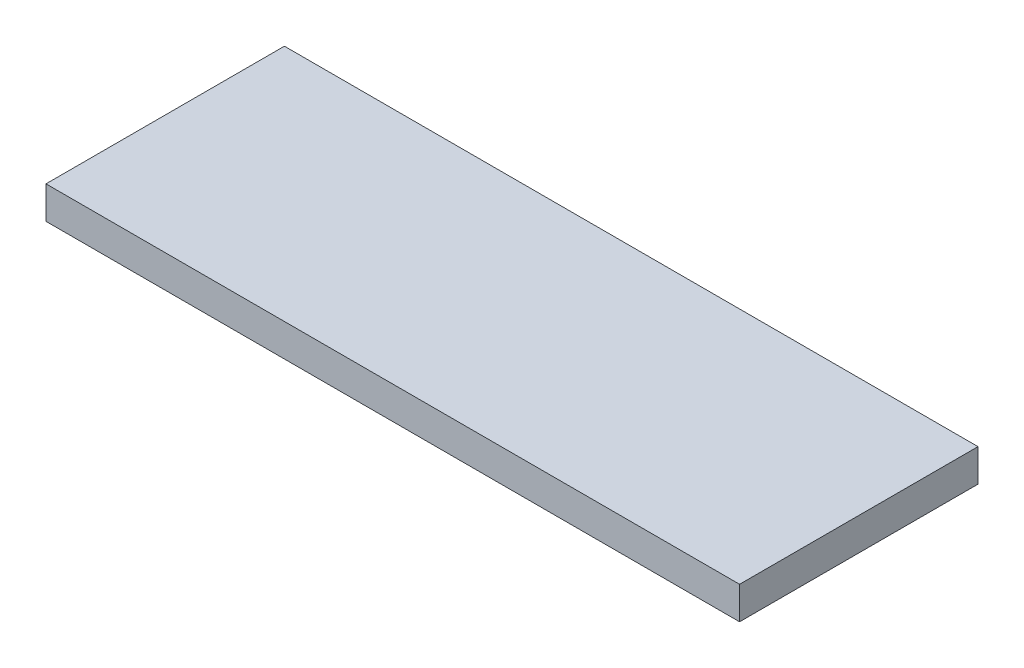
ISO-10303-21;
HEADER;
FILE_DESCRIPTION(('STEP AP214'),'2;1');
FILE_NAME('part.step','',(''),(''),'','','');
FILE_SCHEMA(('AUTOMOTIVE_DESIGN { 1 0 10303 214 1 1 1 1 }'));
ENDSEC;
DATA;
#1=APPLICATION_CONTEXT('core data for automotive mechanical design processes');
#2=APPLICATION_PROTOCOL_DEFINITION('international standard','automotive_design',2000,#1);
#3=PRODUCT_CONTEXT('',#1,'mechanical');
#4=PRODUCT('Part','Part','',(#3));
#5=PRODUCT_RELATED_PRODUCT_CATEGORY('part','',(#4));
#6=PRODUCT_DEFINITION_FORMATION('','',#4);
#7=PRODUCT_DEFINITION_CONTEXT('part definition',#1,'design');
#8=PRODUCT_DEFINITION('design','',#6,#7);
#9=PRODUCT_DEFINITION_SHAPE('','',#8);
#10=(LENGTH_UNIT() NAMED_UNIT(*) SI_UNIT(.MILLI.,.METRE.));
#11=(NAMED_UNIT(*) PLANE_ANGLE_UNIT() SI_UNIT($,.RADIAN.));
#12=(NAMED_UNIT(*) SI_UNIT($,.STERADIAN.) SOLID_ANGLE_UNIT());
#13=UNCERTAINTY_MEASURE_WITH_UNIT(LENGTH_MEASURE(1.E-05),#10,'distance_accuracy_value','');
#14=(GEOMETRIC_REPRESENTATION_CONTEXT(3) GLOBAL_UNCERTAINTY_ASSIGNED_CONTEXT((#13)) GLOBAL_UNIT_ASSIGNED_CONTEXT((#10,
#11,#12)) REPRESENTATION_CONTEXT('',''));
#15=CARTESIAN_POINT('',(0.,0.,0.));
#16=DIRECTION('',(0.,0.,1.));
#17=DIRECTION('',(1.,0.,0.));
#18=AXIS2_PLACEMENT_3D('',#15,#16,#17);
#19=CARTESIAN_POINT('',(80.,3.75,-27.5));
#20=DIRECTION('',(-1.,0.,0.));
#21=DIRECTION('',(0.,0.,1.));
#22=AXIS2_PLACEMENT_3D('',#19,#20,#21);
#23=PLANE('',#22);
#24=DIRECTION('',(0.,0.,-1.));
#25=VECTOR('',#24,1.);
#26=CARTESIAN_POINT('',(80.,-3.75,-27.5));
#27=LINE('',#26,#25);
#28=CARTESIAN_POINT('',(80.,-3.75,27.5));
#29=VERTEX_POINT('',#28);
#30=CARTESIAN_POINT('',(80.,-3.75,-27.5));
#31=VERTEX_POINT('',#30);
#32=EDGE_CURVE('E349',#29,#31,#27,.T.);
#33=ORIENTED_EDGE('',*,*,#32,.T.);
#34=DIRECTION('',(0.,-1.,0.));
#35=VECTOR('',#34,1.);
#36=CARTESIAN_POINT('',(80.,3.75,-27.5));
#37=LINE('',#36,#35);
#38=CARTESIAN_POINT('',(80.,3.75,-27.5));
#39=VERTEX_POINT('',#38);
#40=EDGE_CURVE('E11',#39,#31,#37,.T.);
#41=ORIENTED_EDGE('',*,*,#40,.F.);
#42=DIRECTION('',(0.,0.,-1.));
#43=VECTOR('',#42,1.);
#44=CARTESIAN_POINT('',(80.,3.75,-27.5));
#45=LINE('',#44,#43);
#46=CARTESIAN_POINT('',(80.,3.75,27.5));
#47=VERTEX_POINT('',#46);
#48=EDGE_CURVE('E359',#47,#39,#45,.T.);
#49=ORIENTED_EDGE('',*,*,#48,.F.);
#50=DIRECTION('',(0.,-1.,0.));
#51=VECTOR('',#50,1.);
#52=CARTESIAN_POINT('',(80.,3.75,27.5));
#53=LINE('',#52,#51);
#54=EDGE_CURVE('E373',#47,#29,#53,.T.);
#55=ORIENTED_EDGE('',*,*,#54,.T.);
#56=EDGE_LOOP('',(#33,#41,#49,#55));
#57=FACE_BOUND('',#56,.T.);
#58=ADVANCED_FACE('F41',(#57),#23,.F.);
#59=CARTESIAN_POINT('',(-80.,3.75,-27.5));
#60=DIRECTION('',(0.,0.,1.));
#61=DIRECTION('',(1.,0.,0.));
#62=AXIS2_PLACEMENT_3D('',#59,#60,#61);
#63=PLANE('',#62);
#64=DIRECTION('',(-1.,0.,0.));
#65=VECTOR('',#64,1.);
#66=CARTESIAN_POINT('',(-80.,-3.75,-27.5));
#67=LINE('',#66,#65);
#68=CARTESIAN_POINT('',(-80.,-3.75,-27.5));
#69=VERTEX_POINT('',#68);
#70=EDGE_CURVE('E377',#31,#69,#67,.T.);
#71=ORIENTED_EDGE('',*,*,#70,.T.);
#72=DIRECTION('',(0.,-1.,0.));
#73=VECTOR('',#72,1.);
#74=CARTESIAN_POINT('',(-80.,3.75,-27.5));
#75=LINE('',#74,#73);
#76=CARTESIAN_POINT('',(-80.,3.75,-27.5));
#77=VERTEX_POINT('',#76);
#78=EDGE_CURVE('E49',#77,#69,#75,.T.);
#79=ORIENTED_EDGE('',*,*,#78,.F.);
#80=DIRECTION('',(-1.,0.,0.));
#81=VECTOR('',#80,1.);
#82=CARTESIAN_POINT('',(-80.,3.75,-27.5));
#83=LINE('',#82,#81);
#84=EDGE_CURVE('E363',#39,#77,#83,.T.);
#85=ORIENTED_EDGE('',*,*,#84,.F.);
#86=ORIENTED_EDGE('',*,*,#40,.T.);
#87=EDGE_LOOP('',(#71,#79,#85,#86));
#88=FACE_BOUND('',#87,.T.);
#89=ADVANCED_FACE('F413',(#88),#63,.F.);
#90=CARTESIAN_POINT('',(-80.,3.75,-27.5));
#91=DIRECTION('',(1.,0.,0.));
#92=DIRECTION('',(0.,0.,-1.));
#93=AXIS2_PLACEMENT_3D('',#90,#91,#92);
#94=PLANE('',#93);
#95=DIRECTION('',(0.,0.,1.));
#96=VECTOR('',#95,1.);
#97=CARTESIAN_POINT('',(-80.,-3.75,-27.5));
#98=LINE('',#97,#96);
#99=CARTESIAN_POINT('',(-80.,-3.75,27.5));
#100=VERTEX_POINT('',#99);
#101=EDGE_CURVE('E380',#69,#100,#98,.T.);
#102=ORIENTED_EDGE('',*,*,#101,.T.);
#103=DIRECTION('',(0.,-1.,0.));
#104=VECTOR('',#103,1.);
#105=CARTESIAN_POINT('',(-80.,3.75,27.5));
#106=LINE('',#105,#104);
#107=CARTESIAN_POINT('',(-80.,3.75,27.5));
#108=VERTEX_POINT('',#107);
#109=EDGE_CURVE('E388',#108,#100,#106,.T.);
#110=ORIENTED_EDGE('',*,*,#109,.F.);
#111=DIRECTION('',(0.,0.,1.));
#112=VECTOR('',#111,1.);
#113=CARTESIAN_POINT('',(-80.,3.75,-27.5));
#114=LINE('',#113,#112);
#115=EDGE_CURVE('E367',#77,#108,#114,.T.);
#116=ORIENTED_EDGE('',*,*,#115,.F.);
#117=ORIENTED_EDGE('',*,*,#78,.T.);
#118=EDGE_LOOP('',(#102,#110,#116,#117));
#119=FACE_BOUND('',#118,.T.);
#120=ADVANCED_FACE('F397',(#119),#94,.F.);
#121=CARTESIAN_POINT('',(-80.,3.75,27.5));
#122=DIRECTION('',(0.,0.,-1.));
#123=DIRECTION('',(-1.,0.,0.));
#124=AXIS2_PLACEMENT_3D('',#121,#122,#123);
#125=PLANE('',#124);
#126=DIRECTION('',(1.,0.,0.));
#127=VECTOR('',#126,1.);
#128=CARTESIAN_POINT('',(-80.,-3.75,27.5));
#129=LINE('',#128,#127);
#130=EDGE_CURVE('E364',#100,#29,#129,.T.);
#131=ORIENTED_EDGE('',*,*,#130,.T.);
#132=ORIENTED_EDGE('',*,*,#54,.F.);
#133=DIRECTION('',(1.,0.,0.));
#134=VECTOR('',#133,1.);
#135=CARTESIAN_POINT('',(-80.,3.75,27.5));
#136=LINE('',#135,#134);
#137=EDGE_CURVE('E370',#108,#47,#136,.T.);
#138=ORIENTED_EDGE('',*,*,#137,.F.);
#139=ORIENTED_EDGE('',*,*,#109,.T.);
#140=EDGE_LOOP('',(#131,#132,#138,#139));
#141=FACE_BOUND('',#140,.T.);
#142=ADVANCED_FACE('F406',(#141),#125,.F.);
#143=CARTESIAN_POINT('',(0.,3.75,0.));
#144=DIRECTION('',(0.,1.,0.));
#145=DIRECTION('',(0.,0.,1.));
#146=AXIS2_PLACEMENT_3D('',#143,#144,#145);
#147=PLANE('',#146);
#148=ORIENTED_EDGE('',*,*,#48,.T.);
#149=ORIENTED_EDGE('',*,*,#84,.T.);
#150=ORIENTED_EDGE('',*,*,#115,.T.);
#151=ORIENTED_EDGE('',*,*,#137,.T.);
#152=EDGE_LOOP('',(#148,#149,#150,#151));
#153=FACE_BOUND('',#152,.T.);
#154=ADVANCED_FACE('F412',(#153),#147,.T.);
#155=CARTESIAN_POINT('',(0.,-3.75,0.));
#156=DIRECTION('',(0.,1.,0.));
#157=DIRECTION('',(0.,0.,1.));
#158=AXIS2_PLACEMENT_3D('',#155,#156,#157);
#159=PLANE('',#158);
#160=DIRECTION('',(1.,0.,0.));
#161=VECTOR('',#160,1.);
#162=CARTESIAN_POINT('',(-31.1681547239452,-3.75,9.49999999999309));
#163=LINE('',#162,#161);
#164=CARTESIAN_POINT('',(-41.1681547239446,-3.75,9.49999999999308));
#165=VERTEX_POINT('',#164);
#166=CARTESIAN_POINT('',(-31.1681547239452,-3.75,9.49999999999309));
#167=VERTEX_POINT('',#166);
#168=EDGE_CURVE('E266',#165,#167,#163,.T.);
#169=ORIENTED_EDGE('',*,*,#168,.F.);
#170=DIRECTION('',(0.,0.,1.));
#171=VECTOR('',#170,1.);
#172=CARTESIAN_POINT('',(-41.1681547239446,-3.75,9.49999999999308));
#173=LINE('',#172,#171);
#174=CARTESIAN_POINT('',(-41.1681547239446,-3.75,-9.5000000000069));
#175=VERTEX_POINT('',#174);
#176=EDGE_CURVE('E56',#175,#165,#173,.T.);
#177=ORIENTED_EDGE('',*,*,#176,.F.);
#178=DIRECTION('',(-1.,0.,0.));
#179=VECTOR('',#178,1.);
#180=CARTESIAN_POINT('',(-41.1681547239446,-3.75,-9.5000000000069));
#181=LINE('',#180,#179);
#182=CARTESIAN_POINT('',(-31.1681547239452,-3.75,-9.5000000000069));
#183=VERTEX_POINT('',#182);
#184=EDGE_CURVE('E235',#183,#175,#181,.T.);
#185=ORIENTED_EDGE('',*,*,#184,.F.);
#186=DIRECTION('',(0.,0.,1.));
#187=VECTOR('',#186,1.);
#188=CARTESIAN_POINT('',(-31.1681547239452,-3.75,-9.5000000000069));
#189=LINE('',#188,#187);
#190=CARTESIAN_POINT('',(-31.1681547239452,-3.75,-25.5000000000069));
#191=VERTEX_POINT('',#190);
#192=EDGE_CURVE('E286',#191,#183,#189,.T.);
#193=ORIENTED_EDGE('',*,*,#192,.F.);
#194=DIRECTION('',(1.,0.,0.));
#195=VECTOR('',#194,1.);
#196=CARTESIAN_POINT('',(-31.1681547239452,-3.75,-25.5000000000069));
#197=LINE('',#196,#195);
#198=CARTESIAN_POINT('',(-77.1681547239451,-3.75,-25.5000000000069));
#199=VERTEX_POINT('',#198);
#200=EDGE_CURVE('E282',#199,#191,#197,.T.);
#201=ORIENTED_EDGE('',*,*,#200,.F.);
#202=DIRECTION('',(0.,0.,-1.));
#203=VECTOR('',#202,1.);
#204=CARTESIAN_POINT('',(-77.1681547239451,-3.75,-25.5000000000069));
#205=LINE('',#204,#203);
#206=CARTESIAN_POINT('',(-77.1681547239451,-3.75,25.5000000000001));
#207=VERTEX_POINT('',#206);
#208=EDGE_CURVE('E278',#207,#199,#205,.T.);
#209=ORIENTED_EDGE('',*,*,#208,.F.);
#210=DIRECTION('',(-1.,0.,0.));
#211=VECTOR('',#210,1.);
#212=CARTESIAN_POINT('',(-77.1681547239451,-3.75,25.5000000000001));
#213=LINE('',#212,#211);
#214=CARTESIAN_POINT('',(-31.1681547239452,-3.75,25.5000000000001));
#215=VERTEX_POINT('',#214);
#216=EDGE_CURVE('E274',#215,#207,#213,.T.);
#217=ORIENTED_EDGE('',*,*,#216,.F.);
#218=DIRECTION('',(0.,0.,1.));
#219=VECTOR('',#218,1.);
#220=CARTESIAN_POINT('',(-31.1681547239452,-3.75,25.5000000000001));
#221=LINE('',#220,#219);
#222=EDGE_CURVE('E270',#167,#215,#221,.T.);
#223=ORIENTED_EDGE('',*,*,#222,.F.);
#224=EDGE_LOOP('',(#169,#177,#185,#193,#201,#209,#217,#223));
#225=FACE_BOUND('',#224,.T.);
#226=DIRECTION('',(0.,0.,1.));
#227=VECTOR('',#226,1.);
#228=CARTESIAN_POINT('',(76.1681547239451,-3.75,-24.4999999999931));
#229=LINE('',#228,#227);
#230=CARTESIAN_POINT('',(76.1681547239451,-3.75,-24.4999999999931));
#231=VERTEX_POINT('',#230);
#232=CARTESIAN_POINT('',(76.1681547239451,-3.75,-10.4999999999931));
#233=VERTEX_POINT('',#232);
#234=EDGE_CURVE('E214',#231,#233,#229,.T.);
#235=ORIENTED_EDGE('',*,*,#234,.F.);
#236=DIRECTION('',(1.,0.,0.));
#237=VECTOR('',#236,1.);
#238=CARTESIAN_POINT('',(76.1681547239451,-3.75,-24.4999999999931));
#239=LINE('',#238,#237);
#240=CARTESIAN_POINT('',(62.1681547239451,-3.75,-24.4999999999931));
#241=VERTEX_POINT('',#240);
#242=EDGE_CURVE('E64',#241,#231,#239,.T.);
#243=ORIENTED_EDGE('',*,*,#242,.F.);
#244=DIRECTION('',(0.,0.,-1.));
#245=VECTOR('',#244,1.);
#246=CARTESIAN_POINT('',(62.1681547239451,-3.75,-24.4999999999931));
#247=LINE('',#246,#245);
#248=CARTESIAN_POINT('',(62.1681547239451,-3.75,-10.4999999999931));
#249=VERTEX_POINT('',#248);
#250=EDGE_CURVE('E201',#249,#241,#247,.T.);
#251=ORIENTED_EDGE('',*,*,#250,.F.);
#252=DIRECTION('',(-1.,0.,0.));
#253=VECTOR('',#252,1.);
#254=CARTESIAN_POINT('',(76.1681547239451,-3.75,-10.4999999999931));
#255=LINE('',#254,#253);
#256=EDGE_CURVE('E205',#233,#249,#255,.T.);
#257=ORIENTED_EDGE('',*,*,#256,.F.);
#258=EDGE_LOOP('',(#235,#243,#251,#257));
#259=FACE_BOUND('',#258,.T.);
#260=DIRECTION('',(-1.,0.,0.));
#261=VECTOR('',#260,1.);
#262=CARTESIAN_POINT('',(76.1681547239451,-3.75,24.4999999999931));
#263=LINE('',#262,#261);
#264=CARTESIAN_POINT('',(76.1681547239451,-3.75,24.4999999999931));
#265=VERTEX_POINT('',#264);
#266=CARTESIAN_POINT('',(62.1681547239451,-3.75,24.4999999999931));
#267=VERTEX_POINT('',#266);
#268=EDGE_CURVE('E335',#265,#267,#263,.T.);
#269=ORIENTED_EDGE('',*,*,#268,.F.);
#270=DIRECTION('',(0.,0.,1.));
#271=VECTOR('',#270,1.);
#272=CARTESIAN_POINT('',(76.1681547239451,-3.75,24.4999999999931));
#273=LINE('',#272,#271);
#274=CARTESIAN_POINT('',(76.1681547239451,-3.75,10.4999999999931));
#275=VERTEX_POINT('',#274);
#276=EDGE_CURVE('E224',#275,#265,#273,.T.);
#277=ORIENTED_EDGE('',*,*,#276,.F.);
#278=DIRECTION('',(1.,0.,0.));
#279=VECTOR('',#278,1.);
#280=CARTESIAN_POINT('',(76.1681547239451,-3.75,10.4999999999931));
#281=LINE('',#280,#279);
#282=CARTESIAN_POINT('',(62.1681547239451,-3.75,10.4999999999931));
#283=VERTEX_POINT('',#282);
#284=EDGE_CURVE('E320',#283,#275,#281,.T.);
#285=ORIENTED_EDGE('',*,*,#284,.F.);
#286=DIRECTION('',(0.,0.,-1.));
#287=VECTOR('',#286,1.);
#288=CARTESIAN_POINT('',(62.1681547239451,-3.75,24.4999999999931));
#289=LINE('',#288,#287);
#290=EDGE_CURVE('E339',#267,#283,#289,.T.);
#291=ORIENTED_EDGE('',*,*,#290,.F.);
#292=EDGE_LOOP('',(#269,#277,#285,#291));
#293=FACE_BOUND('',#292,.T.);
#294=ORIENTED_EDGE('',*,*,#32,.F.);
#295=ORIENTED_EDGE('',*,*,#130,.F.);
#296=ORIENTED_EDGE('',*,*,#101,.F.);
#297=ORIENTED_EDGE('',*,*,#70,.F.);
#298=EDGE_LOOP('',(#294,#295,#296,#297));
#299=FACE_BOUND('',#298,.T.);
#300=ADVANCED_FACE('F403',(#225,#259,#293,#299),#159,.F.);
#301=CARTESIAN_POINT('',(76.1681547239451,-0.25,24.4999999999931));
#302=DIRECTION('',(1.,0.,0.));
#303=DIRECTION('',(0.,0.,-1.));
#304=AXIS2_PLACEMENT_3D('',#301,#302,#303);
#305=PLANE('',#304);
#306=ORIENTED_EDGE('',*,*,#276,.T.);
#307=DIRECTION('',(0.,-1.,0.));
#308=VECTOR('',#307,1.);
#309=CARTESIAN_POINT('',(76.1681547239451,-0.25,24.4999999999931));
#310=LINE('',#309,#308);
#311=CARTESIAN_POINT('',(76.1681547239451,-0.25,24.4999999999931));
#312=VERTEX_POINT('',#311);
#313=EDGE_CURVE('E332',#312,#265,#310,.T.);
#314=ORIENTED_EDGE('',*,*,#313,.F.);
#315=DIRECTION('',(0.,0.,1.));
#316=VECTOR('',#315,1.);
#317=CARTESIAN_POINT('',(76.1681547239451,-0.25,24.4999999999931));
#318=LINE('',#317,#316);
#319=CARTESIAN_POINT('',(76.1681547239451,-0.25,10.4999999999931));
#320=VERTEX_POINT('',#319);
#321=EDGE_CURVE('E315',#320,#312,#318,.T.);
#322=ORIENTED_EDGE('',*,*,#321,.F.);
#323=DIRECTION('',(0.,-1.,0.));
#324=VECTOR('',#323,1.);
#325=CARTESIAN_POINT('',(76.1681547239451,-0.25,10.4999999999931));
#326=LINE('',#325,#324);
#327=EDGE_CURVE('E346',#320,#275,#326,.T.);
#328=ORIENTED_EDGE('',*,*,#327,.T.);
#329=EDGE_LOOP('',(#306,#314,#322,#328));
#330=FACE_BOUND('',#329,.T.);
#331=ADVANCED_FACE('F425',(#330),#305,.F.);
#332=CARTESIAN_POINT('',(76.1681547239451,-0.25,10.4999999999931));
#333=DIRECTION('',(0.,0.,-1.));
#334=DIRECTION('',(-1.,0.,0.));
#335=AXIS2_PLACEMENT_3D('',#332,#333,#334);
#336=PLANE('',#335);
#337=ORIENTED_EDGE('',*,*,#284,.T.);
#338=ORIENTED_EDGE('',*,*,#327,.F.);
#339=DIRECTION('',(1.,0.,0.));
#340=VECTOR('',#339,1.);
#341=CARTESIAN_POINT('',(76.1681547239451,-0.25,10.4999999999931));
#342=LINE('',#341,#340);
#343=CARTESIAN_POINT('',(62.1681547239451,-0.25,10.4999999999931));
#344=VERTEX_POINT('',#343);
#345=EDGE_CURVE('E328',#344,#320,#342,.T.);
#346=ORIENTED_EDGE('',*,*,#345,.F.);
#347=DIRECTION('',(0.,-1.,0.));
#348=VECTOR('',#347,1.);
#349=CARTESIAN_POINT('',(62.1681547239451,-0.25,10.4999999999931));
#350=LINE('',#349,#348);
#351=EDGE_CURVE('E350',#344,#283,#350,.T.);
#352=ORIENTED_EDGE('',*,*,#351,.T.);
#353=EDGE_LOOP('',(#337,#338,#346,#352));
#354=FACE_BOUND('',#353,.T.);
#355=ADVANCED_FACE('F431',(#354),#336,.F.);
#356=CARTESIAN_POINT('',(62.1681547239451,-0.25,24.4999999999931));
#357=DIRECTION('',(-1.,0.,0.));
#358=DIRECTION('',(0.,0.,1.));
#359=AXIS2_PLACEMENT_3D('',#356,#357,#358);
#360=PLANE('',#359);
#361=ORIENTED_EDGE('',*,*,#290,.T.);
#362=ORIENTED_EDGE('',*,*,#351,.F.);
#363=DIRECTION('',(0.,0.,-1.));
#364=VECTOR('',#363,1.);
#365=CARTESIAN_POINT('',(62.1681547239451,-0.25,24.4999999999931));
#366=LINE('',#365,#364);
#367=CARTESIAN_POINT('',(62.1681547239451,-0.25,24.4999999999931));
#368=VERTEX_POINT('',#367);
#369=EDGE_CURVE('E324',#368,#344,#366,.T.);
#370=ORIENTED_EDGE('',*,*,#369,.F.);
#371=DIRECTION('',(0.,-1.,0.));
#372=VECTOR('',#371,1.);
#373=CARTESIAN_POINT('',(62.1681547239451,-0.25,24.4999999999931));
#374=LINE('',#373,#372);
#375=EDGE_CURVE('E353',#368,#267,#374,.T.);
#376=ORIENTED_EDGE('',*,*,#375,.T.);
#377=EDGE_LOOP('',(#361,#362,#370,#376));
#378=FACE_BOUND('',#377,.T.);
#379=ADVANCED_FACE('F437',(#378),#360,.F.);
#380=CARTESIAN_POINT('',(76.1681547239451,-0.25,24.4999999999931));
#381=DIRECTION('',(0.,0.,1.));
#382=DIRECTION('',(1.,0.,0.));
#383=AXIS2_PLACEMENT_3D('',#380,#381,#382);
#384=PLANE('',#383);
#385=ORIENTED_EDGE('',*,*,#268,.T.);
#386=ORIENTED_EDGE('',*,*,#375,.F.);
#387=DIRECTION('',(-1.,0.,0.));
#388=VECTOR('',#387,1.);
#389=CARTESIAN_POINT('',(76.1681547239451,-0.25,24.4999999999931));
#390=LINE('',#389,#388);
#391=EDGE_CURVE('E319',#312,#368,#390,.T.);
#392=ORIENTED_EDGE('',*,*,#391,.F.);
#393=ORIENTED_EDGE('',*,*,#313,.T.);
#394=EDGE_LOOP('',(#385,#386,#392,#393));
#395=FACE_BOUND('',#394,.T.);
#396=ADVANCED_FACE('F433',(#395),#384,.F.);
#397=CARTESIAN_POINT('',(0.,-0.25,0.));
#398=DIRECTION('',(0.,1.,0.));
#399=DIRECTION('',(0.,0.,1.));
#400=AXIS2_PLACEMENT_3D('',#397,#398,#399);
#401=PLANE('',#400);
#402=ORIENTED_EDGE('',*,*,#321,.T.);
#403=ORIENTED_EDGE('',*,*,#391,.T.);
#404=ORIENTED_EDGE('',*,*,#369,.T.);
#405=ORIENTED_EDGE('',*,*,#345,.T.);
#406=EDGE_LOOP('',(#402,#403,#404,#405));
#407=FACE_BOUND('',#406,.T.);
#408=ADVANCED_FACE('F436',(#407),#401,.F.);
#409=CARTESIAN_POINT('',(76.1681547239451,-0.25,-24.4999999999931));
#410=DIRECTION('',(0.,0.,-1.));
#411=DIRECTION('',(-1.,0.,0.));
#412=AXIS2_PLACEMENT_3D('',#409,#410,#411);
#413=PLANE('',#412);
#414=ORIENTED_EDGE('',*,*,#242,.T.);
#415=DIRECTION('',(0.,-1.,0.));
#416=VECTOR('',#415,1.);
#417=CARTESIAN_POINT('',(76.1681547239451,-0.25,-24.4999999999931));
#418=LINE('',#417,#416);
#419=CARTESIAN_POINT('',(76.1681547239451,-0.25,-24.4999999999931));
#420=VERTEX_POINT('',#419);
#421=EDGE_CURVE('E176',#420,#231,#418,.T.);
#422=ORIENTED_EDGE('',*,*,#421,.F.);
#423=DIRECTION('',(1.,0.,0.));
#424=VECTOR('',#423,1.);
#425=CARTESIAN_POINT('',(76.1681547239451,-0.25,-24.4999999999931));
#426=LINE('',#425,#424);
#427=CARTESIAN_POINT('',(62.1681547239451,-0.25,-24.4999999999931));
#428=VERTEX_POINT('',#427);
#429=EDGE_CURVE('E180',#428,#420,#426,.T.);
#430=ORIENTED_EDGE('',*,*,#429,.F.);
#431=DIRECTION('',(0.,-1.,0.));
#432=VECTOR('',#431,1.);
#433=CARTESIAN_POINT('',(62.1681547239451,-0.25,-24.4999999999931));
#434=LINE('',#433,#432);
#435=EDGE_CURVE('E221',#428,#241,#434,.T.);
#436=ORIENTED_EDGE('',*,*,#435,.T.);
#437=EDGE_LOOP('',(#414,#422,#430,#436));
#438=FACE_BOUND('',#437,.T.);
#439=ADVANCED_FACE('F178',(#438),#413,.F.);
#440=CARTESIAN_POINT('',(62.1681547239451,-0.25,-24.4999999999931));
#441=DIRECTION('',(-1.,0.,0.));
#442=DIRECTION('',(0.,0.,1.));
#443=AXIS2_PLACEMENT_3D('',#440,#441,#442);
#444=PLANE('',#443);
#445=ORIENTED_EDGE('',*,*,#250,.T.);
#446=ORIENTED_EDGE('',*,*,#435,.F.);
#447=DIRECTION('',(0.,0.,-1.));
#448=VECTOR('',#447,1.);
#449=CARTESIAN_POINT('',(62.1681547239451,-0.25,-24.4999999999931));
#450=LINE('',#449,#448);
#451=CARTESIAN_POINT('',(62.1681547239451,-0.25,-10.4999999999931));
#452=VERTEX_POINT('',#451);
#453=EDGE_CURVE('E187',#452,#428,#450,.T.);
#454=ORIENTED_EDGE('',*,*,#453,.F.);
#455=DIRECTION('',(0.,-1.,0.));
#456=VECTOR('',#455,1.);
#457=CARTESIAN_POINT('',(62.1681547239451,-0.25,-10.4999999999931));
#458=LINE('',#457,#456);
#459=EDGE_CURVE('E225',#452,#249,#458,.T.);
#460=ORIENTED_EDGE('',*,*,#459,.T.);
#461=EDGE_LOOP('',(#445,#446,#454,#460));
#462=FACE_BOUND('',#461,.T.);
#463=ADVANCED_FACE('F485',(#462),#444,.F.);
#464=CARTESIAN_POINT('',(76.1681547239451,-0.25,-10.4999999999931));
#465=DIRECTION('',(0.,0.,1.));
#466=DIRECTION('',(1.,0.,0.));
#467=AXIS2_PLACEMENT_3D('',#464,#465,#466);
#468=PLANE('',#467);
#469=ORIENTED_EDGE('',*,*,#256,.T.);
#470=ORIENTED_EDGE('',*,*,#459,.F.);
#471=DIRECTION('',(-1.,0.,0.));
#472=VECTOR('',#471,1.);
#473=CARTESIAN_POINT('',(76.1681547239451,-0.25,-10.4999999999931));
#474=LINE('',#473,#472);
#475=CARTESIAN_POINT('',(76.1681547239451,-0.25,-10.4999999999931));
#476=VERTEX_POINT('',#475);
#477=EDGE_CURVE('E196',#476,#452,#474,.T.);
#478=ORIENTED_EDGE('',*,*,#477,.F.);
#479=DIRECTION('',(0.,-1.,0.));
#480=VECTOR('',#479,1.);
#481=CARTESIAN_POINT('',(76.1681547239451,-0.25,-10.4999999999931));
#482=LINE('',#481,#480);
#483=EDGE_CURVE('E186',#476,#233,#482,.T.);
#484=ORIENTED_EDGE('',*,*,#483,.T.);
#485=EDGE_LOOP('',(#469,#470,#478,#484));
#486=FACE_BOUND('',#485,.T.);
#487=ADVANCED_FACE('F488',(#486),#468,.F.);
#488=CARTESIAN_POINT('',(76.1681547239451,-0.25,-24.4999999999931));
#489=DIRECTION('',(1.,0.,0.));
#490=DIRECTION('',(0.,0.,-1.));
#491=AXIS2_PLACEMENT_3D('',#488,#489,#490);
#492=PLANE('',#491);
#493=ORIENTED_EDGE('',*,*,#234,.T.);
#494=ORIENTED_EDGE('',*,*,#483,.F.);
#495=DIRECTION('',(0.,0.,1.));
#496=VECTOR('',#495,1.);
#497=CARTESIAN_POINT('',(76.1681547239451,-0.25,-24.4999999999931));
#498=LINE('',#497,#496);
#499=EDGE_CURVE('E190',#420,#476,#498,.T.);
#500=ORIENTED_EDGE('',*,*,#499,.F.);
#501=ORIENTED_EDGE('',*,*,#421,.T.);
#502=EDGE_LOOP('',(#493,#494,#500,#501));
#503=FACE_BOUND('',#502,.T.);
#504=ADVANCED_FACE('F191',(#503),#492,.F.);
#505=CARTESIAN_POINT('',(0.,-0.25,0.));
#506=DIRECTION('',(0.,1.,0.));
#507=DIRECTION('',(0.,0.,1.));
#508=AXIS2_PLACEMENT_3D('',#505,#506,#507);
#509=PLANE('',#508);
#510=ORIENTED_EDGE('',*,*,#429,.T.);
#511=ORIENTED_EDGE('',*,*,#499,.T.);
#512=ORIENTED_EDGE('',*,*,#477,.T.);
#513=ORIENTED_EDGE('',*,*,#453,.T.);
#514=EDGE_LOOP('',(#510,#511,#512,#513));
#515=FACE_BOUND('',#514,.T.);
#516=ADVANCED_FACE('F198',(#515),#509,.F.);
#517=CARTESIAN_POINT('',(-41.1681547239446,-0.25,9.49999999999308));
#518=DIRECTION('',(1.,0.,0.));
#519=DIRECTION('',(0.,0.,-1.));
#520=AXIS2_PLACEMENT_3D('',#517,#518,#519);
#521=PLANE('',#520);
#522=ORIENTED_EDGE('',*,*,#176,.T.);
#523=DIRECTION('',(0.,-1.,0.));
#524=VECTOR('',#523,1.);
#525=CARTESIAN_POINT('',(-41.1681547239446,-0.25,9.49999999999308));
#526=LINE('',#525,#524);
#527=CARTESIAN_POINT('',(-41.1681547239446,-0.25,9.49999999999308));
#528=VERTEX_POINT('',#527);
#529=EDGE_CURVE('E263',#528,#165,#526,.T.);
#530=ORIENTED_EDGE('',*,*,#529,.F.);
#531=DIRECTION('',(0.,0.,1.));
#532=VECTOR('',#531,1.);
#533=CARTESIAN_POINT('',(-41.1681547239446,-0.25,9.49999999999308));
#534=LINE('',#533,#532);
#535=CARTESIAN_POINT('',(-41.1681547239446,-0.25,-9.5000000000069));
#536=VERTEX_POINT('',#535);
#537=EDGE_CURVE('E230',#536,#528,#534,.T.);
#538=ORIENTED_EDGE('',*,*,#537,.F.);
#539=DIRECTION('',(0.,-1.,0.));
#540=VECTOR('',#539,1.);
#541=CARTESIAN_POINT('',(-41.1681547239446,-0.25,-9.5000000000069));
#542=LINE('',#541,#540);
#543=EDGE_CURVE('E215',#536,#175,#542,.T.);
#544=ORIENTED_EDGE('',*,*,#543,.T.);
#545=EDGE_LOOP('',(#522,#530,#538,#544));
#546=FACE_BOUND('',#545,.T.);
#547=ADVANCED_FACE('F448',(#546),#521,.F.);
#548=CARTESIAN_POINT('',(-41.1681547239446,-0.25,-9.5000000000069));
#549=DIRECTION('',(0.,0.,1.));
#550=DIRECTION('',(1.,0.,0.));
#551=AXIS2_PLACEMENT_3D('',#548,#549,#550);
#552=PLANE('',#551);
#553=ORIENTED_EDGE('',*,*,#184,.T.);
#554=ORIENTED_EDGE('',*,*,#543,.F.);
#555=DIRECTION('',(-1.,0.,0.));
#556=VECTOR('',#555,1.);
#557=CARTESIAN_POINT('',(-41.1681547239446,-0.25,-9.5000000000069));
#558=LINE('',#557,#556);
#559=CARTESIAN_POINT('',(-31.1681547239452,-0.25,-9.5000000000069));
#560=VERTEX_POINT('',#559);
#561=EDGE_CURVE('E259',#560,#536,#558,.T.);
#562=ORIENTED_EDGE('',*,*,#561,.F.);
#563=DIRECTION('',(0.,-1.,0.));
#564=VECTOR('',#563,1.);
#565=CARTESIAN_POINT('',(-31.1681547239452,-0.25,-9.5000000000069));
#566=LINE('',#565,#564);
#567=EDGE_CURVE('E295',#560,#183,#566,.T.);
#568=ORIENTED_EDGE('',*,*,#567,.T.);
#569=EDGE_LOOP('',(#553,#554,#562,#568));
#570=FACE_BOUND('',#569,.T.);
#571=ADVANCED_FACE('F451',(#570),#552,.F.);
#572=CARTESIAN_POINT('',(-31.1681547239452,-0.25,-9.5000000000069));
#573=DIRECTION('',(1.,0.,0.));
#574=DIRECTION('',(0.,0.,-1.));
#575=AXIS2_PLACEMENT_3D('',#572,#573,#574);
#576=PLANE('',#575);
#577=ORIENTED_EDGE('',*,*,#192,.T.);
#578=ORIENTED_EDGE('',*,*,#567,.F.);
#579=DIRECTION('',(0.,0.,1.));
#580=VECTOR('',#579,1.);
#581=CARTESIAN_POINT('',(-31.1681547239452,-0.25,-9.5000000000069));
#582=LINE('',#581,#580);
#583=CARTESIAN_POINT('',(-31.1681547239452,-0.25,-25.5000000000069));
#584=VERTEX_POINT('',#583);
#585=EDGE_CURVE('E255',#584,#560,#582,.T.);
#586=ORIENTED_EDGE('',*,*,#585,.F.);
#587=DIRECTION('',(0.,-1.,0.));
#588=VECTOR('',#587,1.);
#589=CARTESIAN_POINT('',(-31.1681547239452,-0.25,-25.5000000000069));
#590=LINE('',#589,#588);
#591=EDGE_CURVE('E298',#584,#191,#590,.T.);
#592=ORIENTED_EDGE('',*,*,#591,.T.);
#593=EDGE_LOOP('',(#577,#578,#586,#592));
#594=FACE_BOUND('',#593,.T.);
#595=ADVANCED_FACE('F472',(#594),#576,.F.);
#596=CARTESIAN_POINT('',(-31.1681547239452,-0.25,-25.5000000000069));
#597=DIRECTION('',(0.,0.,-1.));
#598=DIRECTION('',(-1.,0.,0.));
#599=AXIS2_PLACEMENT_3D('',#596,#597,#598);
#600=PLANE('',#599);
#601=ORIENTED_EDGE('',*,*,#200,.T.);
#602=ORIENTED_EDGE('',*,*,#591,.F.);
#603=DIRECTION('',(1.,0.,0.));
#604=VECTOR('',#603,1.);
#605=CARTESIAN_POINT('',(-31.1681547239452,-0.25,-25.5000000000069));
#606=LINE('',#605,#604);
#607=CARTESIAN_POINT('',(-77.1681547239451,-0.25,-25.5000000000069));
#608=VERTEX_POINT('',#607);
#609=EDGE_CURVE('E251',#608,#584,#606,.T.);
#610=ORIENTED_EDGE('',*,*,#609,.F.);
#611=DIRECTION('',(0.,-1.,0.));
#612=VECTOR('',#611,1.);
#613=CARTESIAN_POINT('',(-77.1681547239451,-0.25,-25.5000000000069));
#614=LINE('',#613,#612);
#615=EDGE_CURVE('E301',#608,#199,#614,.T.);
#616=ORIENTED_EDGE('',*,*,#615,.T.);
#617=EDGE_LOOP('',(#601,#602,#610,#616));
#618=FACE_BOUND('',#617,.T.);
#619=ADVANCED_FACE('F468',(#618),#600,.F.);
#620=CARTESIAN_POINT('',(-77.1681547239451,-0.25,-25.5000000000069));
#621=DIRECTION('',(-1.,0.,0.));
#622=DIRECTION('',(0.,0.,1.));
#623=AXIS2_PLACEMENT_3D('',#620,#621,#622);
#624=PLANE('',#623);
#625=ORIENTED_EDGE('',*,*,#208,.T.);
#626=ORIENTED_EDGE('',*,*,#615,.F.);
#627=DIRECTION('',(0.,0.,-1.));
#628=VECTOR('',#627,1.);
#629=CARTESIAN_POINT('',(-77.1681547239451,-0.25,-25.5000000000069));
#630=LINE('',#629,#628);
#631=CARTESIAN_POINT('',(-77.1681547239451,-0.25,25.5000000000001));
#632=VERTEX_POINT('',#631);
#633=EDGE_CURVE('E247',#632,#608,#630,.T.);
#634=ORIENTED_EDGE('',*,*,#633,.F.);
#635=DIRECTION('',(0.,-1.,0.));
#636=VECTOR('',#635,1.);
#637=CARTESIAN_POINT('',(-77.1681547239451,-0.25,25.5000000000001));
#638=LINE('',#637,#636);
#639=EDGE_CURVE('E304',#632,#207,#638,.T.);
#640=ORIENTED_EDGE('',*,*,#639,.T.);
#641=EDGE_LOOP('',(#625,#626,#634,#640));
#642=FACE_BOUND('',#641,.T.);
#643=ADVANCED_FACE('F464',(#642),#624,.F.);
#644=CARTESIAN_POINT('',(-77.1681547239451,-0.25,25.5000000000001));
#645=DIRECTION('',(0.,0.,1.));
#646=DIRECTION('',(1.,0.,0.));
#647=AXIS2_PLACEMENT_3D('',#644,#645,#646);
#648=PLANE('',#647);
#649=ORIENTED_EDGE('',*,*,#216,.T.);
#650=ORIENTED_EDGE('',*,*,#639,.F.);
#651=DIRECTION('',(-1.,0.,0.));
#652=VECTOR('',#651,1.);
#653=CARTESIAN_POINT('',(-77.1681547239451,-0.25,25.5000000000001));
#654=LINE('',#653,#652);
#655=CARTESIAN_POINT('',(-31.1681547239452,-0.25,25.5000000000001));
#656=VERTEX_POINT('',#655);
#657=EDGE_CURVE('E243',#656,#632,#654,.T.);
#658=ORIENTED_EDGE('',*,*,#657,.F.);
#659=DIRECTION('',(0.,-1.,0.));
#660=VECTOR('',#659,1.);
#661=CARTESIAN_POINT('',(-31.1681547239452,-0.25,25.5000000000001));
#662=LINE('',#661,#660);
#663=EDGE_CURVE('E307',#656,#215,#662,.T.);
#664=ORIENTED_EDGE('',*,*,#663,.T.);
#665=EDGE_LOOP('',(#649,#650,#658,#664));
#666=FACE_BOUND('',#665,.T.);
#667=ADVANCED_FACE('F460',(#666),#648,.F.);
#668=CARTESIAN_POINT('',(-31.1681547239452,-0.25,25.5000000000001));
#669=DIRECTION('',(1.,0.,0.));
#670=DIRECTION('',(0.,0.,-1.));
#671=AXIS2_PLACEMENT_3D('',#668,#669,#670);
#672=PLANE('',#671);
#673=ORIENTED_EDGE('',*,*,#222,.T.);
#674=ORIENTED_EDGE('',*,*,#663,.F.);
#675=DIRECTION('',(0.,0.,1.));
#676=VECTOR('',#675,1.);
#677=CARTESIAN_POINT('',(-31.1681547239452,-0.25,25.5000000000001));
#678=LINE('',#677,#676);
#679=CARTESIAN_POINT('',(-31.1681547239452,-0.25,9.49999999999309));
#680=VERTEX_POINT('',#679);
#681=EDGE_CURVE('E239',#680,#656,#678,.T.);
#682=ORIENTED_EDGE('',*,*,#681,.F.);
#683=DIRECTION('',(0.,-1.,0.));
#684=VECTOR('',#683,1.);
#685=CARTESIAN_POINT('',(-31.1681547239452,-0.25,9.49999999999309));
#686=LINE('',#685,#684);
#687=EDGE_CURVE('E310',#680,#167,#686,.T.);
#688=ORIENTED_EDGE('',*,*,#687,.T.);
#689=EDGE_LOOP('',(#673,#674,#682,#688));
#690=FACE_BOUND('',#689,.T.);
#691=ADVANCED_FACE('F456',(#690),#672,.F.);
#692=CARTESIAN_POINT('',(-31.1681547239452,-0.25,9.49999999999309));
#693=DIRECTION('',(0.,0.,-1.));
#694=DIRECTION('',(-1.,0.,0.));
#695=AXIS2_PLACEMENT_3D('',#692,#693,#694);
#696=PLANE('',#695);
#697=ORIENTED_EDGE('',*,*,#168,.T.);
#698=ORIENTED_EDGE('',*,*,#687,.F.);
#699=DIRECTION('',(1.,0.,0.));
#700=VECTOR('',#699,1.);
#701=CARTESIAN_POINT('',(-31.1681547239452,-0.25,9.49999999999309));
#702=LINE('',#701,#700);
#703=EDGE_CURVE('E234',#528,#680,#702,.T.);
#704=ORIENTED_EDGE('',*,*,#703,.F.);
#705=ORIENTED_EDGE('',*,*,#529,.T.);
#706=EDGE_LOOP('',(#697,#698,#704,#705));
#707=FACE_BOUND('',#706,.T.);
#708=ADVANCED_FACE('F452',(#707),#696,.F.);
#709=CARTESIAN_POINT('',(0.,-0.25,0.));
#710=DIRECTION('',(0.,-1.,0.));
#711=DIRECTION('',(0.,0.,-1.));
#712=AXIS2_PLACEMENT_3D('',#709,#710,#711);
#713=PLANE('',#712);
#714=ORIENTED_EDGE('',*,*,#537,.T.);
#715=ORIENTED_EDGE('',*,*,#703,.T.);
#716=ORIENTED_EDGE('',*,*,#681,.T.);
#717=ORIENTED_EDGE('',*,*,#657,.T.);
#718=ORIENTED_EDGE('',*,*,#633,.T.);
#719=ORIENTED_EDGE('',*,*,#609,.T.);
#720=ORIENTED_EDGE('',*,*,#585,.T.);
#721=ORIENTED_EDGE('',*,*,#561,.T.);
#722=EDGE_LOOP('',(#714,#715,#716,#717,#718,#719,#720,#721));
#723=FACE_BOUND('',#722,.T.);
#724=ADVANCED_FACE('F455',(#723),#713,.T.);
#725=CLOSED_SHELL('',(#58,#89,#120,#142,#154,#300,#331,#355,#379,#396,#408,#439,#463,#487,#504,
#516,#547,#571,#595,#619,#643,#667,#691,#708,#724));
#726=MANIFOLD_SOLID_BREP('B2',#725);
#727=ADVANCED_BREP_SHAPE_REPRESENTATION('',(#18,#726),#14);
#728=SHAPE_DEFINITION_REPRESENTATION(#9,#727);
ENDSEC;
END-ISO-10303-21;
